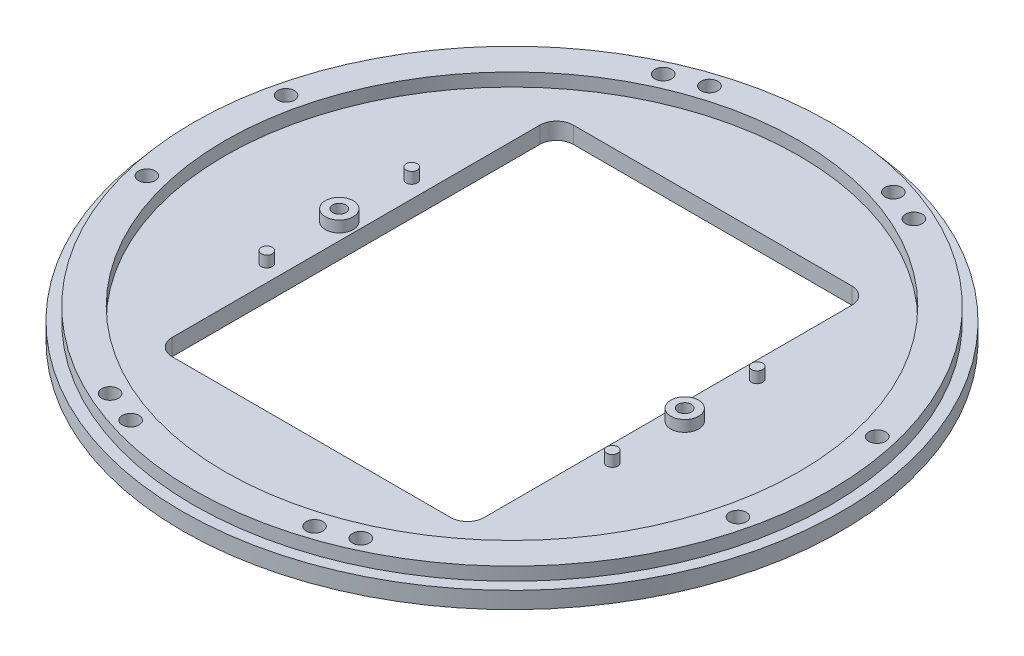
ISO-10303-21;
HEADER;
FILE_DESCRIPTION(('STEP AP214'),'2;1');
FILE_NAME('part.step','',(''),(''),'','','');
FILE_SCHEMA(('AUTOMOTIVE_DESIGN { 1 0 10303 214 1 1 1 1 }'));
ENDSEC;
DATA;
#1=APPLICATION_CONTEXT('core data for automotive mechanical design processes');
#2=APPLICATION_PROTOCOL_DEFINITION('international standard','automotive_design',2000,#1);
#3=PRODUCT_CONTEXT('',#1,'mechanical');
#4=PRODUCT('Part','Part','',(#3));
#5=PRODUCT_RELATED_PRODUCT_CATEGORY('part','',(#4));
#6=PRODUCT_DEFINITION_FORMATION('','',#4);
#7=PRODUCT_DEFINITION_CONTEXT('part definition',#1,'design');
#8=PRODUCT_DEFINITION('design','',#6,#7);
#9=PRODUCT_DEFINITION_SHAPE('','',#8);
#10=(LENGTH_UNIT() NAMED_UNIT(*) SI_UNIT(.MILLI.,.METRE.));
#11=(NAMED_UNIT(*) PLANE_ANGLE_UNIT() SI_UNIT($,.RADIAN.));
#12=(NAMED_UNIT(*) SI_UNIT($,.STERADIAN.) SOLID_ANGLE_UNIT());
#13=UNCERTAINTY_MEASURE_WITH_UNIT(LENGTH_MEASURE(1.E-05),#10,'distance_accuracy_value','');
#14=(GEOMETRIC_REPRESENTATION_CONTEXT(3) GLOBAL_UNCERTAINTY_ASSIGNED_CONTEXT((#13)) GLOBAL_UNIT_ASSIGNED_CONTEXT((#10,
#11,#12)) REPRESENTATION_CONTEXT('',''));
#15=CARTESIAN_POINT('',(0.,0.,0.));
#16=DIRECTION('',(0.,0.,1.));
#17=DIRECTION('',(1.,0.,0.));
#18=AXIS2_PLACEMENT_3D('',#15,#16,#17);
#19=CARTESIAN_POINT('',(0.,0.,0.));
#20=DIRECTION('',(0.,-1.,0.));
#21=DIRECTION('',(0.,0.,-1.));
#22=AXIS2_PLACEMENT_3D('',#19,#20,#21);
#23=CYLINDRICAL_SURFACE('',#22,51.5);
#24=CARTESIAN_POINT('',(0.,2.35000000000001,0.));
#25=DIRECTION('',(0.,-1.,0.));
#26=DIRECTION('',(0.,0.,-1.));
#27=AXIS2_PLACEMENT_3D('',#24,#25,#26);
#28=CIRCLE('',#27,51.5);
#29=CARTESIAN_POINT('',(0.,2.35000000000001,-51.5));
#30=VERTEX_POINT('',#29);
#31=EDGE_CURVE('E220',#30,#30,#28,.T.);
#32=ORIENTED_EDGE('',*,*,#31,.F.);
#33=EDGE_LOOP('',(#32));
#34=FACE_BOUND('',#33,.T.);
#35=CARTESIAN_POINT('',(0.,0.,0.));
#36=DIRECTION('',(0.,-1.,0.));
#37=DIRECTION('',(0.,0.,-1.));
#38=AXIS2_PLACEMENT_3D('',#35,#36,#37);
#39=CIRCLE('',#38,51.5);
#40=CARTESIAN_POINT('',(0.,0.,-51.5));
#41=VERTEX_POINT('',#40);
#42=EDGE_CURVE('E178',#41,#41,#39,.F.);
#43=ORIENTED_EDGE('',*,*,#42,.F.);
#44=EDGE_LOOP('',(#43));
#45=FACE_BOUND('',#44,.T.);
#46=ADVANCED_FACE('F58',(#34,#45),#23,.F.);
#47=CARTESIAN_POINT('',(57.15,2.35000000000001,0.));
#48=DIRECTION('',(0.,1.,0.));
#49=DIRECTION('',(0.,0.,1.));
#50=AXIS2_PLACEMENT_3D('',#47,#48,#49);
#51=PLANE('',#50);
#52=CARTESIAN_POINT('',(-53.0471488394994,2.35000000000001,-12.5));
#53=DIRECTION('',(0.,-1.,0.));
#54=DIRECTION('',(0.,0.,1.));
#55=AXIS2_PLACEMENT_3D('',#52,#53,#54);
#56=CIRCLE('',#55,1.5);
#57=CARTESIAN_POINT('',(-53.0471488394994,2.35000000000001,-11.));
#58=VERTEX_POINT('',#57);
#59=EDGE_CURVE('E569',#58,#58,#56,.T.);
#60=ORIENTED_EDGE('',*,*,#59,.T.);
#61=EDGE_LOOP('',(#60));
#62=FACE_BOUND('',#61,.T.);
#63=CARTESIAN_POINT('',(53.0471488394994,2.35000000000001,-12.5));
#64=DIRECTION('',(0.,-1.,0.));
#65=DIRECTION('',(0.,0.,-1.));
#66=AXIS2_PLACEMENT_3D('',#63,#64,#65);
#67=CIRCLE('',#66,1.5);
#68=CARTESIAN_POINT('',(53.0471488394994,2.35000000000001,-14.));
#69=VERTEX_POINT('',#68);
#70=EDGE_CURVE('E573',#69,#69,#67,.T.);
#71=ORIENTED_EDGE('',*,*,#70,.T.);
#72=EDGE_LOOP('',(#71));
#73=FACE_BOUND('',#72,.T.);
#74=CARTESIAN_POINT('',(53.0471488394994,2.35000000000001,12.5));
#75=DIRECTION('',(0.,-1.,0.));
#76=DIRECTION('',(0.,0.,1.));
#77=AXIS2_PLACEMENT_3D('',#74,#75,#76);
#78=CIRCLE('',#77,1.5);
#79=CARTESIAN_POINT('',(53.0471488394994,2.35000000000001,14.));
#80=VERTEX_POINT('',#79);
#81=EDGE_CURVE('E565',#80,#80,#78,.T.);
#82=ORIENTED_EDGE('',*,*,#81,.T.);
#83=EDGE_LOOP('',(#82));
#84=FACE_BOUND('',#83,.T.);
#85=CARTESIAN_POINT('',(-53.0471488394994,2.35000000000001,12.5));
#86=DIRECTION('',(0.,-1.,0.));
#87=DIRECTION('',(0.,0.,-1.));
#88=AXIS2_PLACEMENT_3D('',#85,#86,#87);
#89=CIRCLE('',#88,1.5);
#90=CARTESIAN_POINT('',(-53.0471488394994,2.35000000000001,11.));
#91=VERTEX_POINT('',#90);
#92=EDGE_CURVE('E521',#91,#91,#89,.T.);
#93=ORIENTED_EDGE('',*,*,#92,.T.);
#94=EDGE_LOOP('',(#93));
#95=FACE_BOUND('',#94,.T.);
#96=CARTESIAN_POINT('',(-22.5,2.35000000000001,49.6386945839634));
#97=DIRECTION('',(0.,1.,0.));
#98=DIRECTION('',(0.,0.,1.));
#99=AXIS2_PLACEMENT_3D('',#96,#97,#98);
#100=CIRCLE('',#99,1.5);
#101=CARTESIAN_POINT('',(-22.5,2.35000000000001,51.1386945839634));
#102=VERTEX_POINT('',#101);
#103=EDGE_CURVE('E183',#102,#102,#100,.T.);
#104=ORIENTED_EDGE('',*,*,#103,.F.);
#105=EDGE_LOOP('',(#104));
#106=FACE_BOUND('',#105,.T.);
#107=CARTESIAN_POINT('',(-22.5,2.35000000000001,-49.6386945839634));
#108=DIRECTION('',(0.,1.,0.));
#109=DIRECTION('',(0.,0.,-1.));
#110=AXIS2_PLACEMENT_3D('',#107,#108,#109);
#111=CIRCLE('',#110,1.50000000000001);
#112=CARTESIAN_POINT('',(-22.5,2.35000000000001,-51.1386945839634));
#113=VERTEX_POINT('',#112);
#114=EDGE_CURVE('E189',#113,#113,#111,.T.);
#115=ORIENTED_EDGE('',*,*,#114,.F.);
#116=EDGE_LOOP('',(#115));
#117=FACE_BOUND('',#116,.T.);
#118=CARTESIAN_POINT('',(-16.5,2.35000000000001,-51.9422756528822));
#119=DIRECTION('',(0.,1.,0.));
#120=DIRECTION('',(0.,0.,-1.));
#121=AXIS2_PLACEMENT_3D('',#118,#119,#120);
#122=CIRCLE('',#121,1.50000000000001);
#123=CARTESIAN_POINT('',(-16.5,2.35000000000001,-53.4422756528822));
#124=VERTEX_POINT('',#123);
#125=EDGE_CURVE('E195',#124,#124,#122,.T.);
#126=ORIENTED_EDGE('',*,*,#125,.F.);
#127=EDGE_LOOP('',(#126));
#128=FACE_BOUND('',#127,.T.);
#129=CARTESIAN_POINT('',(16.5,2.35000000000001,-51.9422756528822));
#130=DIRECTION('',(0.,1.,0.));
#131=DIRECTION('',(0.,0.,1.));
#132=AXIS2_PLACEMENT_3D('',#129,#130,#131);
#133=CIRCLE('',#132,1.50000000000001);
#134=CARTESIAN_POINT('',(16.5,2.35000000000001,-50.4422756528822));
#135=VERTEX_POINT('',#134);
#136=EDGE_CURVE('E162',#135,#135,#133,.T.);
#137=ORIENTED_EDGE('',*,*,#136,.F.);
#138=EDGE_LOOP('',(#137));
#139=FACE_BOUND('',#138,.T.);
#140=CARTESIAN_POINT('',(22.5,2.35000000000001,-49.6386945839634));
#141=DIRECTION('',(0.,1.,0.));
#142=DIRECTION('',(0.,0.,1.));
#143=AXIS2_PLACEMENT_3D('',#140,#141,#142);
#144=CIRCLE('',#143,1.50000000000001);
#145=CARTESIAN_POINT('',(22.5,2.35000000000001,-48.1386945839634));
#146=VERTEX_POINT('',#145);
#147=EDGE_CURVE('E163',#146,#146,#144,.T.);
#148=ORIENTED_EDGE('',*,*,#147,.F.);
#149=EDGE_LOOP('',(#148));
#150=FACE_BOUND('',#149,.T.);
#151=CARTESIAN_POINT('',(22.5,2.35000000000001,49.6386945839634));
#152=DIRECTION('',(0.,1.,0.));
#153=DIRECTION('',(0.,0.,-1.));
#154=AXIS2_PLACEMENT_3D('',#151,#152,#153);
#155=CIRCLE('',#154,1.5);
#156=CARTESIAN_POINT('',(22.5,2.35000000000001,48.1386945839634));
#157=VERTEX_POINT('',#156);
#158=EDGE_CURVE('E169',#157,#157,#155,.T.);
#159=ORIENTED_EDGE('',*,*,#158,.F.);
#160=EDGE_LOOP('',(#159));
#161=FACE_BOUND('',#160,.T.);
#162=CARTESIAN_POINT('',(16.5,2.35000000000001,51.9422756528822));
#163=DIRECTION('',(0.,1.,0.));
#164=DIRECTION('',(0.,0.,-1.));
#165=AXIS2_PLACEMENT_3D('',#162,#163,#164);
#166=CIRCLE('',#165,1.5);
#167=CARTESIAN_POINT('',(16.5,2.35000000000001,50.4422756528822));
#168=VERTEX_POINT('',#167);
#169=EDGE_CURVE('E175',#168,#168,#166,.T.);
#170=ORIENTED_EDGE('',*,*,#169,.F.);
#171=EDGE_LOOP('',(#170));
#172=FACE_BOUND('',#171,.T.);
#173=CARTESIAN_POINT('',(-16.5,2.35000000000001,51.9422756528822));
#174=DIRECTION('',(0.,1.,0.));
#175=DIRECTION('',(0.,0.,1.));
#176=AXIS2_PLACEMENT_3D('',#173,#174,#175);
#177=CIRCLE('',#176,1.5);
#178=CARTESIAN_POINT('',(-16.5,2.35000000000001,53.4422756528822));
#179=VERTEX_POINT('',#178);
#180=EDGE_CURVE('E182',#179,#179,#177,.T.);
#181=ORIENTED_EDGE('',*,*,#180,.F.);
#182=EDGE_LOOP('',(#181));
#183=FACE_BOUND('',#182,.T.);
#184=ORIENTED_EDGE('',*,*,#31,.T.);
#185=EDGE_LOOP('',(#184));
#186=FACE_BOUND('',#185,.T.);
#187=CARTESIAN_POINT('',(0.,2.35000000000001,0.));
#188=DIRECTION('',(0.,-1.,0.));
#189=DIRECTION('',(0.,0.,-1.));
#190=AXIS2_PLACEMENT_3D('',#187,#188,#189);
#191=CIRCLE('',#190,57.15);
#192=CARTESIAN_POINT('',(0.,2.35000000000001,-57.15));
#193=VERTEX_POINT('',#192);
#194=EDGE_CURVE('E206',#193,#193,#191,.T.);
#195=ORIENTED_EDGE('',*,*,#194,.F.);
#196=EDGE_LOOP('',(#195));
#197=FACE_BOUND('',#196,.T.);
#198=ADVANCED_FACE('F291',(#62,#73,#84,#95,#106,#117,#128,#139,#150,#161,#172,#183,#186,#197),
#51,.T.);
#199=CARTESIAN_POINT('',(51.5,-2.99999999999999,0.));
#200=DIRECTION('',(0.,-1.,0.));
#201=DIRECTION('',(0.,0.,-1.));
#202=AXIS2_PLACEMENT_3D('',#199,#200,#201);
#203=PLANE('',#202);
#204=CARTESIAN_POINT('',(-53.0471488394994,-2.99999999999999,-12.5));
#205=DIRECTION('',(0.,-1.,0.));
#206=DIRECTION('',(0.,0.,1.));
#207=AXIS2_PLACEMENT_3D('',#204,#205,#206);
#208=CIRCLE('',#207,1.5);
#209=CARTESIAN_POINT('',(-53.0471488394994,-2.99999999999999,-11.));
#210=VERTEX_POINT('',#209);
#211=EDGE_CURVE('E450',#210,#210,#208,.T.);
#212=ORIENTED_EDGE('',*,*,#211,.F.);
#213=EDGE_LOOP('',(#212));
#214=FACE_BOUND('',#213,.T.);
#215=CARTESIAN_POINT('',(53.0471488394994,-2.99999999999999,-12.5));
#216=DIRECTION('',(0.,-1.,0.));
#217=DIRECTION('',(0.,0.,-1.));
#218=AXIS2_PLACEMENT_3D('',#215,#216,#217);
#219=CIRCLE('',#218,1.5);
#220=CARTESIAN_POINT('',(53.0471488394994,-2.99999999999999,-14.));
#221=VERTEX_POINT('',#220);
#222=EDGE_CURVE('E454',#221,#221,#219,.T.);
#223=ORIENTED_EDGE('',*,*,#222,.F.);
#224=EDGE_LOOP('',(#223));
#225=FACE_BOUND('',#224,.T.);
#226=CARTESIAN_POINT('',(53.0471488394994,-2.99999999999999,12.5));
#227=DIRECTION('',(0.,-1.,0.));
#228=DIRECTION('',(0.,0.,1.));
#229=AXIS2_PLACEMENT_3D('',#226,#227,#228);
#230=CIRCLE('',#229,1.5);
#231=CARTESIAN_POINT('',(53.0471488394994,-2.99999999999999,14.));
#232=VERTEX_POINT('',#231);
#233=EDGE_CURVE('E458',#232,#232,#230,.T.);
#234=ORIENTED_EDGE('',*,*,#233,.F.);
#235=EDGE_LOOP('',(#234));
#236=FACE_BOUND('',#235,.T.);
#237=CARTESIAN_POINT('',(-53.0471488394994,-2.99999999999999,12.5));
#238=DIRECTION('',(0.,-1.,0.));
#239=DIRECTION('',(0.,0.,-1.));
#240=AXIS2_PLACEMENT_3D('',#237,#238,#239);
#241=CIRCLE('',#240,1.5);
#242=CARTESIAN_POINT('',(-53.0471488394994,-2.99999999999999,11.));
#243=VERTEX_POINT('',#242);
#244=EDGE_CURVE('E462',#243,#243,#241,.T.);
#245=ORIENTED_EDGE('',*,*,#244,.F.);
#246=EDGE_LOOP('',(#245));
#247=FACE_BOUND('',#246,.T.);
#248=CARTESIAN_POINT('',(31.,-2.99999999999999,0.));
#249=DIRECTION('',(0.,1.,0.));
#250=DIRECTION('',(0.,0.,1.));
#251=AXIS2_PLACEMENT_3D('',#248,#249,#250);
#252=CIRCLE('',#251,1.2);
#253=CARTESIAN_POINT('',(31.,-2.99999999999999,1.2));
#254=VERTEX_POINT('',#253);
#255=EDGE_CURVE('E466',#254,#254,#252,.T.);
#256=ORIENTED_EDGE('',*,*,#255,.T.);
#257=EDGE_LOOP('',(#256));
#258=FACE_BOUND('',#257,.T.);
#259=CARTESIAN_POINT('',(-31.,-2.99999999999999,0.));
#260=DIRECTION('',(0.,1.,0.));
#261=DIRECTION('',(0.,0.,1.));
#262=AXIS2_PLACEMENT_3D('',#259,#260,#261);
#263=CIRCLE('',#262,1.2);
#264=CARTESIAN_POINT('',(-31.,-2.99999999999999,1.20000000000001));
#265=VERTEX_POINT('',#264);
#266=EDGE_CURVE('E470',#265,#265,#263,.T.);
#267=ORIENTED_EDGE('',*,*,#266,.T.);
#268=EDGE_LOOP('',(#267));
#269=FACE_BOUND('',#268,.T.);
#270=CARTESIAN_POINT('',(-22.5,-2.99999999999999,49.6386945839634));
#271=DIRECTION('',(0.,1.,0.));
#272=DIRECTION('',(0.,0.,1.));
#273=AXIS2_PLACEMENT_3D('',#270,#271,#272);
#274=CIRCLE('',#273,1.5);
#275=CARTESIAN_POINT('',(-22.5,-2.99999999999999,51.1386945839634));
#276=VERTEX_POINT('',#275);
#277=EDGE_CURVE('E179',#276,#276,#274,.T.);
#278=ORIENTED_EDGE('',*,*,#277,.T.);
#279=EDGE_LOOP('',(#278));
#280=FACE_BOUND('',#279,.T.);
#281=CARTESIAN_POINT('',(-22.5,-2.99999999999999,-49.6386945839634));
#282=DIRECTION('',(0.,1.,0.));
#283=DIRECTION('',(0.,0.,-1.));
#284=AXIS2_PLACEMENT_3D('',#281,#282,#283);
#285=CIRCLE('',#284,1.50000000000001);
#286=CARTESIAN_POINT('',(-22.5,-2.99999999999999,-51.1386945839634));
#287=VERTEX_POINT('',#286);
#288=EDGE_CURVE('E186',#287,#287,#285,.T.);
#289=ORIENTED_EDGE('',*,*,#288,.T.);
#290=EDGE_LOOP('',(#289));
#291=FACE_BOUND('',#290,.T.);
#292=CARTESIAN_POINT('',(-16.5,-2.99999999999999,-51.9422756528822));
#293=DIRECTION('',(0.,1.,0.));
#294=DIRECTION('',(0.,0.,-1.));
#295=AXIS2_PLACEMENT_3D('',#292,#293,#294);
#296=CIRCLE('',#295,1.50000000000001);
#297=CARTESIAN_POINT('',(-16.5,-2.99999999999999,-53.4422756528822));
#298=VERTEX_POINT('',#297);
#299=EDGE_CURVE('E192',#298,#298,#296,.T.);
#300=ORIENTED_EDGE('',*,*,#299,.T.);
#301=EDGE_LOOP('',(#300));
#302=FACE_BOUND('',#301,.T.);
#303=CARTESIAN_POINT('',(16.5,-2.99999999999999,-51.9422756528822));
#304=DIRECTION('',(0.,1.,0.));
#305=DIRECTION('',(0.,0.,1.));
#306=AXIS2_PLACEMENT_3D('',#303,#304,#305);
#307=CIRCLE('',#306,1.50000000000001);
#308=CARTESIAN_POINT('',(16.5,-2.99999999999999,-50.4422756528822));
#309=VERTEX_POINT('',#308);
#310=EDGE_CURVE('E198',#309,#309,#307,.T.);
#311=ORIENTED_EDGE('',*,*,#310,.T.);
#312=EDGE_LOOP('',(#311));
#313=FACE_BOUND('',#312,.T.);
#314=CARTESIAN_POINT('',(22.5,-2.99999999999999,-49.6386945839634));
#315=DIRECTION('',(0.,1.,0.));
#316=DIRECTION('',(0.,0.,1.));
#317=AXIS2_PLACEMENT_3D('',#314,#315,#316);
#318=CIRCLE('',#317,1.50000000000001);
#319=CARTESIAN_POINT('',(22.5,-2.99999999999999,-48.1386945839634));
#320=VERTEX_POINT('',#319);
#321=EDGE_CURVE('E159',#320,#320,#318,.T.);
#322=ORIENTED_EDGE('',*,*,#321,.T.);
#323=EDGE_LOOP('',(#322));
#324=FACE_BOUND('',#323,.T.);
#325=CARTESIAN_POINT('',(22.5,-2.99999999999999,49.6386945839634));
#326=DIRECTION('',(0.,1.,0.));
#327=DIRECTION('',(0.,0.,-1.));
#328=AXIS2_PLACEMENT_3D('',#325,#326,#327);
#329=CIRCLE('',#328,1.5);
#330=CARTESIAN_POINT('',(22.5,-2.99999999999999,48.1386945839634));
#331=VERTEX_POINT('',#330);
#332=EDGE_CURVE('E166',#331,#331,#329,.T.);
#333=ORIENTED_EDGE('',*,*,#332,.T.);
#334=EDGE_LOOP('',(#333));
#335=FACE_BOUND('',#334,.T.);
#336=CARTESIAN_POINT('',(16.5,-2.99999999999999,51.9422756528822));
#337=DIRECTION('',(0.,1.,0.));
#338=DIRECTION('',(0.,0.,-1.));
#339=AXIS2_PLACEMENT_3D('',#336,#337,#338);
#340=CIRCLE('',#339,1.5);
#341=CARTESIAN_POINT('',(16.5,-2.99999999999999,50.4422756528822));
#342=VERTEX_POINT('',#341);
#343=EDGE_CURVE('E172',#342,#342,#340,.T.);
#344=ORIENTED_EDGE('',*,*,#343,.T.);
#345=EDGE_LOOP('',(#344));
#346=FACE_BOUND('',#345,.T.);
#347=CARTESIAN_POINT('',(-16.5,-2.99999999999999,51.9422756528822));
#348=DIRECTION('',(0.,1.,0.));
#349=DIRECTION('',(0.,0.,1.));
#350=AXIS2_PLACEMENT_3D('',#347,#348,#349);
#351=CIRCLE('',#350,1.5);
#352=CARTESIAN_POINT('',(-16.5,-2.99999999999999,53.4422756528822));
#353=VERTEX_POINT('',#352);
#354=EDGE_CURVE('E203',#353,#353,#351,.T.);
#355=ORIENTED_EDGE('',*,*,#354,.T.);
#356=EDGE_LOOP('',(#355));
#357=FACE_BOUND('',#356,.T.);
#358=CARTESIAN_POINT('',(0.,-2.99999999999999,0.));
#359=DIRECTION('',(0.,-1.,0.));
#360=DIRECTION('',(0.,0.,-1.));
#361=AXIS2_PLACEMENT_3D('',#358,#359,#360);
#362=CIRCLE('',#361,59.15);
#363=CARTESIAN_POINT('',(0.,-2.99999999999999,-59.15));
#364=VERTEX_POINT('',#363);
#365=EDGE_CURVE('E217',#364,#364,#362,.T.);
#366=ORIENTED_EDGE('',*,*,#365,.T.);
#367=EDGE_LOOP('',(#366));
#368=FACE_BOUND('',#367,.T.);
#369=DIRECTION('',(1.,0.,0.));
#370=VECTOR('',#369,1.);
#371=CARTESIAN_POINT('',(0.,-2.99999999999999,-36.));
#372=LINE('',#371,#370);
#373=CARTESIAN_POINT('',(-25.,-2.99999999999999,-36.));
#374=VERTEX_POINT('',#373);
#375=CARTESIAN_POINT('',(25.,-2.99999999999999,-36.));
#376=VERTEX_POINT('',#375);
#377=EDGE_CURVE('E148',#374,#376,#372,.T.);
#378=ORIENTED_EDGE('',*,*,#377,.F.);
#379=CARTESIAN_POINT('',(-25.,-2.99999999999999,-33.));
#380=DIRECTION('',(0.,-1.,0.));
#381=DIRECTION('',(0.,0.,-1.));
#382=AXIS2_PLACEMENT_3D('',#379,#380,#381);
#383=CIRCLE('',#382,3.);
#384=CARTESIAN_POINT('',(-28.,-2.99999999999999,-33.));
#385=VERTEX_POINT('',#384);
#386=EDGE_CURVE('E66',#374,#385,#383,.F.);
#387=ORIENTED_EDGE('',*,*,#386,.T.);
#388=DIRECTION('',(0.,0.,-1.));
#389=VECTOR('',#388,1.);
#390=CARTESIAN_POINT('',(-28.,-2.99999999999999,0.));
#391=LINE('',#390,#389);
#392=CARTESIAN_POINT('',(-28.,-2.99999999999999,33.));
#393=VERTEX_POINT('',#392);
#394=EDGE_CURVE('E139',#393,#385,#391,.T.);
#395=ORIENTED_EDGE('',*,*,#394,.F.);
#396=CARTESIAN_POINT('',(-25.,-2.99999999999999,33.));
#397=DIRECTION('',(0.,-1.,0.));
#398=DIRECTION('',(0.,0.,-1.));
#399=AXIS2_PLACEMENT_3D('',#396,#397,#398);
#400=CIRCLE('',#399,3.);
#401=CARTESIAN_POINT('',(-25.,-2.99999999999999,36.));
#402=VERTEX_POINT('',#401);
#403=EDGE_CURVE('E123',#393,#402,#400,.F.);
#404=ORIENTED_EDGE('',*,*,#403,.T.);
#405=DIRECTION('',(1.,0.,0.));
#406=VECTOR('',#405,1.);
#407=CARTESIAN_POINT('',(0.,-2.99999999999999,36.));
#408=LINE('',#407,#406);
#409=CARTESIAN_POINT('',(25.,-2.99999999999999,36.));
#410=VERTEX_POINT('',#409);
#411=EDGE_CURVE('E147',#402,#410,#408,.T.);
#412=ORIENTED_EDGE('',*,*,#411,.T.);
#413=CARTESIAN_POINT('',(25.,-2.99999999999999,33.));
#414=DIRECTION('',(0.,-1.,0.));
#415=DIRECTION('',(0.,0.,-1.));
#416=AXIS2_PLACEMENT_3D('',#413,#414,#415);
#417=CIRCLE('',#416,3.);
#418=CARTESIAN_POINT('',(28.,-2.99999999999999,33.));
#419=VERTEX_POINT('',#418);
#420=EDGE_CURVE('E255',#410,#419,#417,.F.);
#421=ORIENTED_EDGE('',*,*,#420,.T.);
#422=DIRECTION('',(0.,0.,-1.));
#423=VECTOR('',#422,1.);
#424=CARTESIAN_POINT('',(28.,-2.99999999999999,0.));
#425=LINE('',#424,#423);
#426=CARTESIAN_POINT('',(28.,-2.99999999999999,-33.));
#427=VERTEX_POINT('',#426);
#428=EDGE_CURVE('E150',#419,#427,#425,.T.);
#429=ORIENTED_EDGE('',*,*,#428,.T.);
#430=CARTESIAN_POINT('',(25.,-2.99999999999999,-33.));
#431=DIRECTION('',(0.,-1.,0.));
#432=DIRECTION('',(0.,0.,-1.));
#433=AXIS2_PLACEMENT_3D('',#430,#431,#432);
#434=CIRCLE('',#433,3.);
#435=EDGE_CURVE('E259',#427,#376,#434,.F.);
#436=ORIENTED_EDGE('',*,*,#435,.T.);
#437=EDGE_LOOP('',(#378,#387,#395,#404,#412,#421,#429,#436));
#438=FACE_BOUND('',#437,.T.);
#439=ADVANCED_FACE('F146',(#214,#225,#236,#247,#258,#269,#280,#291,#302,#313,#324,#335,#346,
#357,#368,#438),#203,.T.);
#440=CARTESIAN_POINT('',(0.,0.,0.));
#441=DIRECTION('',(0.,-1.,0.));
#442=DIRECTION('',(0.,0.,-1.));
#443=AXIS2_PLACEMENT_3D('',#440,#441,#442);
#444=CYLINDRICAL_SURFACE('',#443,59.15);
#445=CARTESIAN_POINT('',(0.,0.,0.));
#446=DIRECTION('',(0.,-1.,0.));
#447=DIRECTION('',(0.,0.,-1.));
#448=AXIS2_PLACEMENT_3D('',#445,#446,#447);
#449=CIRCLE('',#448,59.15);
#450=CARTESIAN_POINT('',(0.,0.,-59.15));
#451=VERTEX_POINT('',#450);
#452=EDGE_CURVE('E214',#451,#451,#449,.T.);
#453=ORIENTED_EDGE('',*,*,#452,.T.);
#454=EDGE_LOOP('',(#453));
#455=FACE_BOUND('',#454,.T.);
#456=ORIENTED_EDGE('',*,*,#365,.F.);
#457=EDGE_LOOP('',(#456));
#458=FACE_BOUND('',#457,.T.);
#459=ADVANCED_FACE('F434',(#455,#458),#444,.T.);
#460=CARTESIAN_POINT('',(59.15,0.,0.));
#461=DIRECTION('',(0.,1.,0.));
#462=DIRECTION('',(0.,0.,1.));
#463=AXIS2_PLACEMENT_3D('',#460,#461,#462);
#464=PLANE('',#463);
#465=CARTESIAN_POINT('',(0.,0.,0.));
#466=DIRECTION('',(0.,-1.,0.));
#467=DIRECTION('',(0.,0.,-1.));
#468=AXIS2_PLACEMENT_3D('',#465,#466,#467);
#469=CIRCLE('',#468,57.15);
#470=CARTESIAN_POINT('',(0.,0.,-57.15));
#471=VERTEX_POINT('',#470);
#472=EDGE_CURVE('E211',#471,#471,#469,.T.);
#473=ORIENTED_EDGE('',*,*,#472,.T.);
#474=EDGE_LOOP('',(#473));
#475=FACE_BOUND('',#474,.T.);
#476=ORIENTED_EDGE('',*,*,#452,.F.);
#477=EDGE_LOOP('',(#476));
#478=FACE_BOUND('',#477,.T.);
#479=ADVANCED_FACE('F431',(#475,#478),#464,.T.);
#480=CARTESIAN_POINT('',(0.,0.,0.));
#481=DIRECTION('',(0.,-1.,0.));
#482=DIRECTION('',(0.,0.,-1.));
#483=AXIS2_PLACEMENT_3D('',#480,#481,#482);
#484=CYLINDRICAL_SURFACE('',#483,57.15);
#485=ORIENTED_EDGE('',*,*,#194,.T.);
#486=EDGE_LOOP('',(#485));
#487=FACE_BOUND('',#486,.T.);
#488=ORIENTED_EDGE('',*,*,#472,.F.);
#489=EDGE_LOOP('',(#488));
#490=FACE_BOUND('',#489,.T.);
#491=ADVANCED_FACE('F427',(#487,#490),#484,.T.);
#492=CARTESIAN_POINT('',(-16.5,-2.99999999999999,51.9422756528822));
#493=DIRECTION('',(0.,1.,0.));
#494=DIRECTION('',(0.,0.,1.));
#495=AXIS2_PLACEMENT_3D('',#492,#493,#494);
#496=CYLINDRICAL_SURFACE('',#495,1.5);
#497=ORIENTED_EDGE('',*,*,#354,.F.);
#498=EDGE_LOOP('',(#497));
#499=FACE_BOUND('',#498,.T.);
#500=ORIENTED_EDGE('',*,*,#180,.T.);
#501=EDGE_LOOP('',(#500));
#502=FACE_BOUND('',#501,.T.);
#503=ADVANCED_FACE('F409',(#499,#502),#496,.F.);
#504=CARTESIAN_POINT('',(16.5,-2.99999999999999,51.9422756528822));
#505=DIRECTION('',(0.,1.,0.));
#506=DIRECTION('',(0.,0.,1.));
#507=AXIS2_PLACEMENT_3D('',#504,#505,#506);
#508=CYLINDRICAL_SURFACE('',#507,1.5);
#509=ORIENTED_EDGE('',*,*,#343,.F.);
#510=EDGE_LOOP('',(#509));
#511=FACE_BOUND('',#510,.T.);
#512=ORIENTED_EDGE('',*,*,#169,.T.);
#513=EDGE_LOOP('',(#512));
#514=FACE_BOUND('',#513,.T.);
#515=ADVANCED_FACE('F405',(#511,#514),#508,.F.);
#516=CARTESIAN_POINT('',(22.5,-2.99999999999999,49.6386945839634));
#517=DIRECTION('',(0.,1.,0.));
#518=DIRECTION('',(0.,0.,1.));
#519=AXIS2_PLACEMENT_3D('',#516,#517,#518);
#520=CYLINDRICAL_SURFACE('',#519,1.5);
#521=ORIENTED_EDGE('',*,*,#332,.F.);
#522=EDGE_LOOP('',(#521));
#523=FACE_BOUND('',#522,.T.);
#524=ORIENTED_EDGE('',*,*,#158,.T.);
#525=EDGE_LOOP('',(#524));
#526=FACE_BOUND('',#525,.T.);
#527=ADVANCED_FACE('F401',(#523,#526),#520,.F.);
#528=CARTESIAN_POINT('',(22.5,-2.99999999999999,-49.6386945839634));
#529=DIRECTION('',(0.,1.,0.));
#530=DIRECTION('',(0.,0.,1.));
#531=AXIS2_PLACEMENT_3D('',#528,#529,#530);
#532=CYLINDRICAL_SURFACE('',#531,1.50000000000001);
#533=ORIENTED_EDGE('',*,*,#321,.F.);
#534=EDGE_LOOP('',(#533));
#535=FACE_BOUND('',#534,.T.);
#536=ORIENTED_EDGE('',*,*,#147,.T.);
#537=EDGE_LOOP('',(#536));
#538=FACE_BOUND('',#537,.T.);
#539=ADVANCED_FACE('F397',(#535,#538),#532,.F.);
#540=CARTESIAN_POINT('',(16.5,-2.99999999999999,-51.9422756528822));
#541=DIRECTION('',(0.,1.,0.));
#542=DIRECTION('',(0.,0.,1.));
#543=AXIS2_PLACEMENT_3D('',#540,#541,#542);
#544=CYLINDRICAL_SURFACE('',#543,1.50000000000001);
#545=ORIENTED_EDGE('',*,*,#310,.F.);
#546=EDGE_LOOP('',(#545));
#547=FACE_BOUND('',#546,.T.);
#548=ORIENTED_EDGE('',*,*,#136,.T.);
#549=EDGE_LOOP('',(#548));
#550=FACE_BOUND('',#549,.T.);
#551=ADVANCED_FACE('F400',(#547,#550),#544,.F.);
#552=CARTESIAN_POINT('',(-16.5,-2.99999999999999,-51.9422756528822));
#553=DIRECTION('',(0.,1.,0.));
#554=DIRECTION('',(0.,0.,1.));
#555=AXIS2_PLACEMENT_3D('',#552,#553,#554);
#556=CYLINDRICAL_SURFACE('',#555,1.50000000000001);
#557=ORIENTED_EDGE('',*,*,#299,.F.);
#558=EDGE_LOOP('',(#557));
#559=FACE_BOUND('',#558,.T.);
#560=ORIENTED_EDGE('',*,*,#125,.T.);
#561=EDGE_LOOP('',(#560));
#562=FACE_BOUND('',#561,.T.);
#563=ADVANCED_FACE('F417',(#559,#562),#556,.F.);
#564=CARTESIAN_POINT('',(-22.5,-2.99999999999999,-49.6386945839634));
#565=DIRECTION('',(0.,1.,0.));
#566=DIRECTION('',(0.,0.,1.));
#567=AXIS2_PLACEMENT_3D('',#564,#565,#566);
#568=CYLINDRICAL_SURFACE('',#567,1.50000000000001);
#569=ORIENTED_EDGE('',*,*,#288,.F.);
#570=EDGE_LOOP('',(#569));
#571=FACE_BOUND('',#570,.T.);
#572=ORIENTED_EDGE('',*,*,#114,.T.);
#573=EDGE_LOOP('',(#572));
#574=FACE_BOUND('',#573,.T.);
#575=ADVANCED_FACE('F413',(#571,#574),#568,.F.);
#576=CARTESIAN_POINT('',(-22.5,-2.99999999999999,49.6386945839634));
#577=DIRECTION('',(0.,1.,0.));
#578=DIRECTION('',(0.,0.,1.));
#579=AXIS2_PLACEMENT_3D('',#576,#577,#578);
#580=CYLINDRICAL_SURFACE('',#579,1.5);
#581=ORIENTED_EDGE('',*,*,#277,.F.);
#582=EDGE_LOOP('',(#581));
#583=FACE_BOUND('',#582,.T.);
#584=ORIENTED_EDGE('',*,*,#103,.T.);
#585=EDGE_LOOP('',(#584));
#586=FACE_BOUND('',#585,.T.);
#587=ADVANCED_FACE('F396',(#583,#586),#580,.F.);
#588=CARTESIAN_POINT('',(0.,0.,-36.));
#589=DIRECTION('',(0.,0.,-1.));
#590=DIRECTION('',(-1.,0.,0.));
#591=AXIS2_PLACEMENT_3D('',#588,#589,#590);
#592=PLANE('',#591);
#593=ORIENTED_EDGE('',*,*,#377,.T.);
#594=DIRECTION('',(0.,-1.,0.));
#595=VECTOR('',#594,1.);
#596=CARTESIAN_POINT('',(25.,0.,-36.));
#597=LINE('',#596,#595);
#598=CARTESIAN_POINT('',(25.,0.,-36.));
#599=VERTEX_POINT('',#598);
#600=EDGE_CURVE('E73',#376,#599,#597,.F.);
#601=ORIENTED_EDGE('',*,*,#600,.T.);
#602=DIRECTION('',(1.,0.,0.));
#603=VECTOR('',#602,1.);
#604=CARTESIAN_POINT('',(0.,0.,-36.));
#605=LINE('',#604,#603);
#606=CARTESIAN_POINT('',(-25.,0.,-36.));
#607=VERTEX_POINT('',#606);
#608=EDGE_CURVE('E158',#607,#599,#605,.T.);
#609=ORIENTED_EDGE('',*,*,#608,.F.);
#610=DIRECTION('',(0.,-1.,0.));
#611=VECTOR('',#610,1.);
#612=CARTESIAN_POINT('',(-25.,-2.99999999999999,-36.));
#613=LINE('',#612,#611);
#614=EDGE_CURVE('E250',#607,#374,#613,.T.);
#615=ORIENTED_EDGE('',*,*,#614,.T.);
#616=EDGE_LOOP('',(#593,#601,#609,#615));
#617=FACE_BOUND('',#616,.T.);
#618=ADVANCED_FACE('F278',(#617),#592,.F.);
#619=CARTESIAN_POINT('',(28.,0.,0.));
#620=DIRECTION('',(-1.,0.,0.));
#621=DIRECTION('',(0.,0.,1.));
#622=AXIS2_PLACEMENT_3D('',#619,#620,#621);
#623=PLANE('',#622);
#624=ORIENTED_EDGE('',*,*,#428,.F.);
#625=DIRECTION('',(0.,-1.,0.));
#626=VECTOR('',#625,1.);
#627=CARTESIAN_POINT('',(28.,0.,33.));
#628=LINE('',#627,#626);
#629=CARTESIAN_POINT('',(28.,0.,33.));
#630=VERTEX_POINT('',#629);
#631=EDGE_CURVE('E248',#419,#630,#628,.F.);
#632=ORIENTED_EDGE('',*,*,#631,.T.);
#633=DIRECTION('',(0.,0.,-1.));
#634=VECTOR('',#633,1.);
#635=CARTESIAN_POINT('',(28.,0.,0.));
#636=LINE('',#635,#634);
#637=CARTESIAN_POINT('',(28.,0.,-33.));
#638=VERTEX_POINT('',#637);
#639=EDGE_CURVE('E267',#630,#638,#636,.T.);
#640=ORIENTED_EDGE('',*,*,#639,.T.);
#641=DIRECTION('',(0.,-1.,0.));
#642=VECTOR('',#641,1.);
#643=CARTESIAN_POINT('',(28.,0.,-33.));
#644=LINE('',#643,#642);
#645=EDGE_CURVE('E245',#638,#427,#644,.T.);
#646=ORIENTED_EDGE('',*,*,#645,.T.);
#647=EDGE_LOOP('',(#624,#632,#640,#646));
#648=FACE_BOUND('',#647,.T.);
#649=ADVANCED_FACE('F273',(#648),#623,.T.);
#650=CARTESIAN_POINT('',(0.,0.,36.));
#651=DIRECTION('',(0.,0.,-1.));
#652=DIRECTION('',(-1.,0.,0.));
#653=AXIS2_PLACEMENT_3D('',#650,#651,#652);
#654=PLANE('',#653);
#655=ORIENTED_EDGE('',*,*,#411,.F.);
#656=DIRECTION('',(0.,-1.,0.));
#657=VECTOR('',#656,1.);
#658=CARTESIAN_POINT('',(-25.,0.,36.));
#659=LINE('',#658,#657);
#660=CARTESIAN_POINT('',(-25.,0.,36.));
#661=VERTEX_POINT('',#660);
#662=EDGE_CURVE('E128',#402,#661,#659,.F.);
#663=ORIENTED_EDGE('',*,*,#662,.T.);
#664=DIRECTION('',(1.,0.,0.));
#665=VECTOR('',#664,1.);
#666=CARTESIAN_POINT('',(0.,0.,36.));
#667=LINE('',#666,#665);
#668=CARTESIAN_POINT('',(25.,0.,36.));
#669=VERTEX_POINT('',#668);
#670=EDGE_CURVE('E275',#661,#669,#667,.T.);
#671=ORIENTED_EDGE('',*,*,#670,.T.);
#672=DIRECTION('',(0.,-1.,0.));
#673=VECTOR('',#672,1.);
#674=CARTESIAN_POINT('',(25.,-2.99999999999999,36.));
#675=LINE('',#674,#673);
#676=EDGE_CURVE('E142',#669,#410,#675,.T.);
#677=ORIENTED_EDGE('',*,*,#676,.T.);
#678=EDGE_LOOP('',(#655,#663,#671,#677));
#679=FACE_BOUND('',#678,.T.);
#680=ADVANCED_FACE('F388',(#679),#654,.T.);
#681=CARTESIAN_POINT('',(-28.,0.,0.));
#682=DIRECTION('',(-1.,0.,0.));
#683=DIRECTION('',(0.,0.,1.));
#684=AXIS2_PLACEMENT_3D('',#681,#682,#683);
#685=PLANE('',#684);
#686=DIRECTION('',(0.,0.,-1.));
#687=VECTOR('',#686,1.);
#688=CARTESIAN_POINT('',(-28.,0.,0.));
#689=LINE('',#688,#687);
#690=CARTESIAN_POINT('',(-28.,0.,33.));
#691=VERTEX_POINT('',#690);
#692=CARTESIAN_POINT('',(-28.,0.,-33.));
#693=VERTEX_POINT('',#692);
#694=EDGE_CURVE('E141',#691,#693,#689,.T.);
#695=ORIENTED_EDGE('',*,*,#694,.F.);
#696=DIRECTION('',(0.,-1.,0.));
#697=VECTOR('',#696,1.);
#698=CARTESIAN_POINT('',(-28.,0.,33.));
#699=LINE('',#698,#697);
#700=EDGE_CURVE('E127',#691,#393,#699,.T.);
#701=ORIENTED_EDGE('',*,*,#700,.T.);
#702=ORIENTED_EDGE('',*,*,#394,.T.);
#703=DIRECTION('',(0.,-1.,0.));
#704=VECTOR('',#703,1.);
#705=CARTESIAN_POINT('',(-28.,0.,-33.));
#706=LINE('',#705,#704);
#707=EDGE_CURVE('E143',#385,#693,#706,.F.);
#708=ORIENTED_EDGE('',*,*,#707,.T.);
#709=EDGE_LOOP('',(#695,#701,#702,#708));
#710=FACE_BOUND('',#709,.T.);
#711=ADVANCED_FACE('F138',(#710),#685,.F.);
#712=CARTESIAN_POINT('',(0.,0.,0.));
#713=DIRECTION('',(0.,-1.,0.));
#714=DIRECTION('',(0.,0.,-1.));
#715=AXIS2_PLACEMENT_3D('',#712,#713,#714);
#716=PLANE('',#715);
#717=CARTESIAN_POINT('',(-31.,0.,0.));
#718=DIRECTION('',(0.,-1.,0.));
#719=DIRECTION('',(0.,0.,-1.));
#720=AXIS2_PLACEMENT_3D('',#717,#718,#719);
#721=CIRCLE('',#720,2.5);
#722=CARTESIAN_POINT('',(-31.,0.,-2.49999999999999));
#723=VERTEX_POINT('',#722);
#724=EDGE_CURVE('E238',#723,#723,#721,.F.);
#725=ORIENTED_EDGE('',*,*,#724,.F.);
#726=EDGE_LOOP('',(#725));
#727=FACE_BOUND('',#726,.T.);
#728=CARTESIAN_POINT('',(31.,0.,0.));
#729=DIRECTION('',(0.,-1.,0.));
#730=DIRECTION('',(0.,0.,-1.));
#731=AXIS2_PLACEMENT_3D('',#728,#729,#730);
#732=CIRCLE('',#731,2.5);
#733=CARTESIAN_POINT('',(31.,0.,-2.5));
#734=VERTEX_POINT('',#733);
#735=EDGE_CURVE('E235',#734,#734,#732,.F.);
#736=ORIENTED_EDGE('',*,*,#735,.F.);
#737=EDGE_LOOP('',(#736));
#738=FACE_BOUND('',#737,.T.);
#739=CARTESIAN_POINT('',(31.,0.,-13.));
#740=DIRECTION('',(0.,-1.,0.));
#741=DIRECTION('',(0.,0.,-1.));
#742=AXIS2_PLACEMENT_3D('',#739,#740,#741);
#743=CIRCLE('',#742,0.999999999999998);
#744=CARTESIAN_POINT('',(31.,0.,-14.));
#745=VERTEX_POINT('',#744);
#746=EDGE_CURVE('E232',#745,#745,#743,.F.);
#747=ORIENTED_EDGE('',*,*,#746,.F.);
#748=EDGE_LOOP('',(#747));
#749=FACE_BOUND('',#748,.T.);
#750=CARTESIAN_POINT('',(-31.,0.,-13.));
#751=DIRECTION('',(0.,-1.,0.));
#752=DIRECTION('',(0.,0.,-1.));
#753=AXIS2_PLACEMENT_3D('',#750,#751,#752);
#754=CIRCLE('',#753,1.);
#755=CARTESIAN_POINT('',(-31.,0.,-14.));
#756=VERTEX_POINT('',#755);
#757=EDGE_CURVE('E229',#756,#756,#754,.F.);
#758=ORIENTED_EDGE('',*,*,#757,.F.);
#759=EDGE_LOOP('',(#758));
#760=FACE_BOUND('',#759,.T.);
#761=CARTESIAN_POINT('',(-31.,0.,13.));
#762=DIRECTION('',(0.,-1.,0.));
#763=DIRECTION('',(0.,0.,-1.));
#764=AXIS2_PLACEMENT_3D('',#761,#762,#763);
#765=CIRCLE('',#764,1.);
#766=CARTESIAN_POINT('',(-31.,0.,12.));
#767=VERTEX_POINT('',#766);
#768=EDGE_CURVE('E226',#767,#767,#765,.F.);
#769=ORIENTED_EDGE('',*,*,#768,.F.);
#770=EDGE_LOOP('',(#769));
#771=FACE_BOUND('',#770,.T.);
#772=CARTESIAN_POINT('',(31.,0.,13.));
#773=DIRECTION('',(0.,-1.,0.));
#774=DIRECTION('',(0.,0.,-1.));
#775=AXIS2_PLACEMENT_3D('',#772,#773,#774);
#776=CIRCLE('',#775,0.999999999999998);
#777=CARTESIAN_POINT('',(31.,0.,12.));
#778=VERTEX_POINT('',#777);
#779=EDGE_CURVE('E223',#778,#778,#776,.F.);
#780=ORIENTED_EDGE('',*,*,#779,.F.);
#781=EDGE_LOOP('',(#780));
#782=FACE_BOUND('',#781,.T.);
#783=ORIENTED_EDGE('',*,*,#694,.T.);
#784=CARTESIAN_POINT('',(-25.,0.,-33.));
#785=DIRECTION('',(0.,-1.,0.));
#786=DIRECTION('',(0.,0.,-1.));
#787=AXIS2_PLACEMENT_3D('',#784,#785,#786);
#788=CIRCLE('',#787,3.);
#789=EDGE_CURVE('E11',#693,#607,#788,.T.);
#790=ORIENTED_EDGE('',*,*,#789,.T.);
#791=ORIENTED_EDGE('',*,*,#608,.T.);
#792=CARTESIAN_POINT('',(25.,0.,-33.));
#793=DIRECTION('',(0.,-1.,0.));
#794=DIRECTION('',(0.,0.,-1.));
#795=AXIS2_PLACEMENT_3D('',#792,#793,#794);
#796=CIRCLE('',#795,3.);
#797=EDGE_CURVE('E261',#599,#638,#796,.T.);
#798=ORIENTED_EDGE('',*,*,#797,.T.);
#799=ORIENTED_EDGE('',*,*,#639,.F.);
#800=CARTESIAN_POINT('',(25.,0.,33.));
#801=DIRECTION('',(0.,-1.,0.));
#802=DIRECTION('',(0.,0.,-1.));
#803=AXIS2_PLACEMENT_3D('',#800,#801,#802);
#804=CIRCLE('',#803,3.);
#805=EDGE_CURVE('E257',#630,#669,#804,.T.);
#806=ORIENTED_EDGE('',*,*,#805,.T.);
#807=ORIENTED_EDGE('',*,*,#670,.F.);
#808=CARTESIAN_POINT('',(-25.,0.,33.));
#809=DIRECTION('',(0.,-1.,0.));
#810=DIRECTION('',(0.,0.,-1.));
#811=AXIS2_PLACEMENT_3D('',#808,#809,#810);
#812=CIRCLE('',#811,3.);
#813=EDGE_CURVE('E133',#661,#691,#812,.T.);
#814=ORIENTED_EDGE('',*,*,#813,.T.);
#815=EDGE_LOOP('',(#783,#790,#791,#798,#799,#806,#807,#814));
#816=FACE_BOUND('',#815,.T.);
#817=ORIENTED_EDGE('',*,*,#42,.T.);
#818=EDGE_LOOP('',(#817));
#819=FACE_BOUND('',#818,.T.);
#820=ADVANCED_FACE('F265',(#727,#738,#749,#760,#771,#782,#816,#819),#716,.F.);
#821=CARTESIAN_POINT('',(31.,2.,13.));
#822=DIRECTION('',(0.,-1.,0.));
#823=DIRECTION('',(0.,0.,-1.));
#824=AXIS2_PLACEMENT_3D('',#821,#822,#823);
#825=CYLINDRICAL_SURFACE('',#824,0.999999999999998);
#826=CARTESIAN_POINT('',(31.,2.,13.));
#827=DIRECTION('',(0.,1.,0.));
#828=DIRECTION('',(0.,0.,1.));
#829=AXIS2_PLACEMENT_3D('',#826,#827,#828);
#830=CIRCLE('',#829,0.999999999999998);
#831=CARTESIAN_POINT('',(31.,2.,14.));
#832=VERTEX_POINT('',#831);
#833=EDGE_CURVE('E152',#832,#832,#830,.T.);
#834=ORIENTED_EDGE('',*,*,#833,.F.);
#835=EDGE_LOOP('',(#834));
#836=FACE_BOUND('',#835,.T.);
#837=ORIENTED_EDGE('',*,*,#779,.T.);
#838=EDGE_LOOP('',(#837));
#839=FACE_BOUND('',#838,.T.);
#840=ADVANCED_FACE('F378',(#836,#839),#825,.T.);
#841=CARTESIAN_POINT('',(31.,2.,13.));
#842=DIRECTION('',(0.,1.,0.));
#843=DIRECTION('',(0.,0.,1.));
#844=AXIS2_PLACEMENT_3D('',#841,#842,#843);
#845=PLANE('',#844);
#846=ORIENTED_EDGE('',*,*,#833,.T.);
#847=EDGE_LOOP('',(#846));
#848=FACE_BOUND('',#847,.T.);
#849=ADVANCED_FACE('F374',(#848),#845,.T.);
#850=CARTESIAN_POINT('',(-31.,2.,13.));
#851=DIRECTION('',(0.,-1.,0.));
#852=DIRECTION('',(0.,0.,-1.));
#853=AXIS2_PLACEMENT_3D('',#850,#851,#852);
#854=CYLINDRICAL_SURFACE('',#853,1.);
#855=CARTESIAN_POINT('',(-31.,2.,13.));
#856=DIRECTION('',(0.,1.,0.));
#857=DIRECTION('',(0.,0.,-1.));
#858=AXIS2_PLACEMENT_3D('',#855,#856,#857);
#859=CIRCLE('',#858,1.);
#860=CARTESIAN_POINT('',(-31.,2.,12.));
#861=VERTEX_POINT('',#860);
#862=EDGE_CURVE('E537',#861,#861,#859,.T.);
#863=ORIENTED_EDGE('',*,*,#862,.F.);
#864=EDGE_LOOP('',(#863));
#865=FACE_BOUND('',#864,.T.);
#866=ORIENTED_EDGE('',*,*,#768,.T.);
#867=EDGE_LOOP('',(#866));
#868=FACE_BOUND('',#867,.T.);
#869=ADVANCED_FACE('F370',(#865,#868),#854,.T.);
#870=CARTESIAN_POINT('',(-31.,2.,13.));
#871=DIRECTION('',(0.,-1.,0.));
#872=DIRECTION('',(0.,0.,-1.));
#873=AXIS2_PLACEMENT_3D('',#870,#871,#872);
#874=PLANE('',#873);
#875=ORIENTED_EDGE('',*,*,#862,.T.);
#876=EDGE_LOOP('',(#875));
#877=FACE_BOUND('',#876,.T.);
#878=ADVANCED_FACE('F366',(#877),#874,.F.);
#879=CARTESIAN_POINT('',(-31.,2.,-13.));
#880=DIRECTION('',(0.,-1.,0.));
#881=DIRECTION('',(0.,0.,-1.));
#882=AXIS2_PLACEMENT_3D('',#879,#880,#881);
#883=CYLINDRICAL_SURFACE('',#882,1.);
#884=CARTESIAN_POINT('',(-31.,2.,-13.));
#885=DIRECTION('',(0.,1.,0.));
#886=DIRECTION('',(0.,0.,1.));
#887=AXIS2_PLACEMENT_3D('',#884,#885,#886);
#888=CIRCLE('',#887,1.);
#889=CARTESIAN_POINT('',(-31.,2.,-12.));
#890=VERTEX_POINT('',#889);
#891=EDGE_CURVE('E534',#890,#890,#888,.T.);
#892=ORIENTED_EDGE('',*,*,#891,.F.);
#893=EDGE_LOOP('',(#892));
#894=FACE_BOUND('',#893,.T.);
#895=ORIENTED_EDGE('',*,*,#757,.T.);
#896=EDGE_LOOP('',(#895));
#897=FACE_BOUND('',#896,.T.);
#898=ADVANCED_FACE('F362',(#894,#897),#883,.T.);
#899=CARTESIAN_POINT('',(-31.,2.,-13.));
#900=DIRECTION('',(0.,1.,0.));
#901=DIRECTION('',(0.,0.,1.));
#902=AXIS2_PLACEMENT_3D('',#899,#900,#901);
#903=PLANE('',#902);
#904=ORIENTED_EDGE('',*,*,#891,.T.);
#905=EDGE_LOOP('',(#904));
#906=FACE_BOUND('',#905,.T.);
#907=ADVANCED_FACE('F358',(#906),#903,.T.);
#908=CARTESIAN_POINT('',(31.,2.,-13.));
#909=DIRECTION('',(0.,-1.,0.));
#910=DIRECTION('',(0.,0.,-1.));
#911=AXIS2_PLACEMENT_3D('',#908,#909,#910);
#912=CYLINDRICAL_SURFACE('',#911,0.999999999999998);
#913=CARTESIAN_POINT('',(31.,2.,-13.));
#914=DIRECTION('',(0.,1.,0.));
#915=DIRECTION('',(0.,0.,-1.));
#916=AXIS2_PLACEMENT_3D('',#913,#914,#915);
#917=CIRCLE('',#916,0.999999999999998);
#918=CARTESIAN_POINT('',(31.,2.,-14.));
#919=VERTEX_POINT('',#918);
#920=EDGE_CURVE('E531',#919,#919,#917,.T.);
#921=ORIENTED_EDGE('',*,*,#920,.F.);
#922=EDGE_LOOP('',(#921));
#923=FACE_BOUND('',#922,.T.);
#924=ORIENTED_EDGE('',*,*,#746,.T.);
#925=EDGE_LOOP('',(#924));
#926=FACE_BOUND('',#925,.T.);
#927=ADVANCED_FACE('F354',(#923,#926),#912,.T.);
#928=CARTESIAN_POINT('',(31.,2.,-13.));
#929=DIRECTION('',(0.,-1.,0.));
#930=DIRECTION('',(0.,0.,-1.));
#931=AXIS2_PLACEMENT_3D('',#928,#929,#930);
#932=PLANE('',#931);
#933=ORIENTED_EDGE('',*,*,#920,.T.);
#934=EDGE_LOOP('',(#933));
#935=FACE_BOUND('',#934,.T.);
#936=ADVANCED_FACE('F350',(#935),#932,.F.);
#937=CARTESIAN_POINT('',(31.,2.,0.));
#938=DIRECTION('',(0.,-1.,0.));
#939=DIRECTION('',(0.,0.,-1.));
#940=AXIS2_PLACEMENT_3D('',#937,#938,#939);
#941=CYLINDRICAL_SURFACE('',#940,2.5);
#942=CARTESIAN_POINT('',(31.,2.,0.));
#943=DIRECTION('',(0.,1.,0.));
#944=DIRECTION('',(0.,0.,1.));
#945=AXIS2_PLACEMENT_3D('',#942,#943,#944);
#946=CIRCLE('',#945,2.5);
#947=CARTESIAN_POINT('',(31.,2.,2.5));
#948=VERTEX_POINT('',#947);
#949=EDGE_CURVE('E528',#948,#948,#946,.T.);
#950=ORIENTED_EDGE('',*,*,#949,.F.);
#951=EDGE_LOOP('',(#950));
#952=FACE_BOUND('',#951,.T.);
#953=ORIENTED_EDGE('',*,*,#735,.T.);
#954=EDGE_LOOP('',(#953));
#955=FACE_BOUND('',#954,.T.);
#956=ADVANCED_FACE('F346',(#952,#955),#941,.T.);
#957=CARTESIAN_POINT('',(31.,2.,0.));
#958=DIRECTION('',(0.,1.,0.));
#959=DIRECTION('',(0.,0.,1.));
#960=AXIS2_PLACEMENT_3D('',#957,#958,#959);
#961=PLANE('',#960);
#962=CARTESIAN_POINT('',(31.,2.,0.));
#963=DIRECTION('',(0.,1.,0.));
#964=DIRECTION('',(0.,0.,1.));
#965=AXIS2_PLACEMENT_3D('',#962,#963,#964);
#966=CIRCLE('',#965,1.2);
#967=CARTESIAN_POINT('',(31.,2.,1.2));
#968=VERTEX_POINT('',#967);
#969=EDGE_CURVE('E515',#968,#968,#966,.T.);
#970=ORIENTED_EDGE('',*,*,#969,.F.);
#971=EDGE_LOOP('',(#970));
#972=FACE_BOUND('',#971,.T.);
#973=ORIENTED_EDGE('',*,*,#949,.T.);
#974=EDGE_LOOP('',(#973));
#975=FACE_BOUND('',#974,.T.);
#976=ADVANCED_FACE('F342',(#972,#975),#961,.T.);
#977=CARTESIAN_POINT('',(-31.,2.,0.));
#978=DIRECTION('',(0.,-1.,0.));
#979=DIRECTION('',(0.,0.,-1.));
#980=AXIS2_PLACEMENT_3D('',#977,#978,#979);
#981=CYLINDRICAL_SURFACE('',#980,2.5);
#982=CARTESIAN_POINT('',(-31.,2.,0.));
#983=DIRECTION('',(0.,1.,0.));
#984=DIRECTION('',(0.,0.,-1.));
#985=AXIS2_PLACEMENT_3D('',#982,#983,#984);
#986=CIRCLE('',#985,2.5);
#987=CARTESIAN_POINT('',(-31.,2.,-2.49999999999999));
#988=VERTEX_POINT('',#987);
#989=EDGE_CURVE('E525',#988,#988,#986,.T.);
#990=ORIENTED_EDGE('',*,*,#989,.F.);
#991=EDGE_LOOP('',(#990));
#992=FACE_BOUND('',#991,.T.);
#993=ORIENTED_EDGE('',*,*,#724,.T.);
#994=EDGE_LOOP('',(#993));
#995=FACE_BOUND('',#994,.T.);
#996=ADVANCED_FACE('F338',(#992,#995),#981,.T.);
#997=CARTESIAN_POINT('',(-31.,2.,0.));
#998=DIRECTION('',(0.,-1.,0.));
#999=DIRECTION('',(0.,0.,-1.));
#1000=AXIS2_PLACEMENT_3D('',#997,#998,#999);
#1001=PLANE('',#1000);
#1002=CARTESIAN_POINT('',(-31.,2.,0.));
#1003=DIRECTION('',(0.,1.,0.));
#1004=DIRECTION('',(0.,0.,1.));
#1005=AXIS2_PLACEMENT_3D('',#1002,#1003,#1004);
#1006=CIRCLE('',#1005,1.2);
#1007=CARTESIAN_POINT('',(-31.,2.,1.20000000000001));
#1008=VERTEX_POINT('',#1007);
#1009=EDGE_CURVE('E516',#1008,#1008,#1006,.T.);
#1010=ORIENTED_EDGE('',*,*,#1009,.F.);
#1011=EDGE_LOOP('',(#1010));
#1012=FACE_BOUND('',#1011,.T.);
#1013=ORIENTED_EDGE('',*,*,#989,.T.);
#1014=EDGE_LOOP('',(#1013));
#1015=FACE_BOUND('',#1014,.T.);
#1016=ADVANCED_FACE('F334',(#1012,#1015),#1001,.F.);
#1017=CARTESIAN_POINT('',(-31.,-2.99999999999999,0.));
#1018=DIRECTION('',(0.,1.,0.));
#1019=DIRECTION('',(0.,0.,1.));
#1020=AXIS2_PLACEMENT_3D('',#1017,#1018,#1019);
#1021=CYLINDRICAL_SURFACE('',#1020,1.2);
#1022=ORIENTED_EDGE('',*,*,#266,.F.);
#1023=EDGE_LOOP('',(#1022));
#1024=FACE_BOUND('',#1023,.T.);
#1025=ORIENTED_EDGE('',*,*,#1009,.T.);
#1026=EDGE_LOOP('',(#1025));
#1027=FACE_BOUND('',#1026,.T.);
#1028=ADVANCED_FACE('F330',(#1024,#1027),#1021,.F.);
#1029=CARTESIAN_POINT('',(31.,-2.99999999999999,0.));
#1030=DIRECTION('',(0.,1.,0.));
#1031=DIRECTION('',(0.,0.,1.));
#1032=AXIS2_PLACEMENT_3D('',#1029,#1030,#1031);
#1033=CYLINDRICAL_SURFACE('',#1032,1.2);
#1034=ORIENTED_EDGE('',*,*,#255,.F.);
#1035=EDGE_LOOP('',(#1034));
#1036=FACE_BOUND('',#1035,.T.);
#1037=ORIENTED_EDGE('',*,*,#969,.T.);
#1038=EDGE_LOOP('',(#1037));
#1039=FACE_BOUND('',#1038,.T.);
#1040=ADVANCED_FACE('F305',(#1036,#1039),#1033,.F.);
#1041=CARTESIAN_POINT('',(-25.,0.,33.));
#1042=DIRECTION('',(0.,-1.,0.));
#1043=DIRECTION('',(0.,0.,-1.));
#1044=AXIS2_PLACEMENT_3D('',#1041,#1042,#1043);
#1045=CYLINDRICAL_SURFACE('',#1044,3.);
#1046=ORIENTED_EDGE('',*,*,#813,.F.);
#1047=ORIENTED_EDGE('',*,*,#662,.F.);
#1048=ORIENTED_EDGE('',*,*,#403,.F.);
#1049=ORIENTED_EDGE('',*,*,#700,.F.);
#1050=EDGE_LOOP('',(#1046,#1047,#1048,#1049));
#1051=FACE_BOUND('',#1050,.T.);
#1052=ADVANCED_FACE('F126',(#1051),#1045,.F.);
#1053=CARTESIAN_POINT('',(25.,0.,33.));
#1054=DIRECTION('',(0.,1.,0.));
#1055=DIRECTION('',(0.,0.,1.));
#1056=AXIS2_PLACEMENT_3D('',#1053,#1054,#1055);
#1057=CYLINDRICAL_SURFACE('',#1056,3.);
#1058=ORIENTED_EDGE('',*,*,#805,.F.);
#1059=ORIENTED_EDGE('',*,*,#631,.F.);
#1060=ORIENTED_EDGE('',*,*,#420,.F.);
#1061=ORIENTED_EDGE('',*,*,#676,.F.);
#1062=EDGE_LOOP('',(#1058,#1059,#1060,#1061));
#1063=FACE_BOUND('',#1062,.T.);
#1064=ADVANCED_FACE('F304',(#1063),#1057,.F.);
#1065=CARTESIAN_POINT('',(25.,0.,-33.));
#1066=DIRECTION('',(0.,-1.,0.));
#1067=DIRECTION('',(0.,0.,-1.));
#1068=AXIS2_PLACEMENT_3D('',#1065,#1066,#1067);
#1069=CYLINDRICAL_SURFACE('',#1068,3.);
#1070=ORIENTED_EDGE('',*,*,#797,.F.);
#1071=ORIENTED_EDGE('',*,*,#600,.F.);
#1072=ORIENTED_EDGE('',*,*,#435,.F.);
#1073=ORIENTED_EDGE('',*,*,#645,.F.);
#1074=EDGE_LOOP('',(#1070,#1071,#1072,#1073));
#1075=FACE_BOUND('',#1074,.T.);
#1076=ADVANCED_FACE('F277',(#1075),#1069,.F.);
#1077=CARTESIAN_POINT('',(-25.,0.,-33.));
#1078=DIRECTION('',(0.,1.,0.));
#1079=DIRECTION('',(0.,0.,1.));
#1080=AXIS2_PLACEMENT_3D('',#1077,#1078,#1079);
#1081=CYLINDRICAL_SURFACE('',#1080,3.);
#1082=ORIENTED_EDGE('',*,*,#789,.F.);
#1083=ORIENTED_EDGE('',*,*,#707,.F.);
#1084=ORIENTED_EDGE('',*,*,#386,.F.);
#1085=ORIENTED_EDGE('',*,*,#614,.F.);
#1086=EDGE_LOOP('',(#1082,#1083,#1084,#1085));
#1087=FACE_BOUND('',#1086,.T.);
#1088=ADVANCED_FACE('F60',(#1087),#1081,.F.);
#1089=CARTESIAN_POINT('',(-53.0471488394994,2.35000000000001,12.5));
#1090=DIRECTION('',(0.,-1.,0.));
#1091=DIRECTION('',(0.,0.,-1.));
#1092=AXIS2_PLACEMENT_3D('',#1089,#1090,#1091);
#1093=CYLINDRICAL_SURFACE('',#1092,1.5);
#1094=ORIENTED_EDGE('',*,*,#92,.F.);
#1095=EDGE_LOOP('',(#1094));
#1096=FACE_BOUND('',#1095,.T.);
#1097=ORIENTED_EDGE('',*,*,#244,.T.);
#1098=EDGE_LOOP('',(#1097));
#1099=FACE_BOUND('',#1098,.T.);
#1100=ADVANCED_FACE('F311',(#1096,#1099),#1093,.F.);
#1101=CARTESIAN_POINT('',(53.0471488394994,2.35000000000001,12.5));
#1102=DIRECTION('',(0.,-1.,0.));
#1103=DIRECTION('',(0.,0.,-1.));
#1104=AXIS2_PLACEMENT_3D('',#1101,#1102,#1103);
#1105=CYLINDRICAL_SURFACE('',#1104,1.5);
#1106=ORIENTED_EDGE('',*,*,#81,.F.);
#1107=EDGE_LOOP('',(#1106));
#1108=FACE_BOUND('',#1107,.T.);
#1109=ORIENTED_EDGE('',*,*,#233,.T.);
#1110=EDGE_LOOP('',(#1109));
#1111=FACE_BOUND('',#1110,.T.);
#1112=ADVANCED_FACE('F314',(#1108,#1111),#1105,.F.);
#1113=CARTESIAN_POINT('',(53.0471488394994,2.35000000000001,-12.5));
#1114=DIRECTION('',(0.,-1.,0.));
#1115=DIRECTION('',(0.,0.,-1.));
#1116=AXIS2_PLACEMENT_3D('',#1113,#1114,#1115);
#1117=CYLINDRICAL_SURFACE('',#1116,1.5);
#1118=ORIENTED_EDGE('',*,*,#70,.F.);
#1119=EDGE_LOOP('',(#1118));
#1120=FACE_BOUND('',#1119,.T.);
#1121=ORIENTED_EDGE('',*,*,#222,.T.);
#1122=EDGE_LOOP('',(#1121));
#1123=FACE_BOUND('',#1122,.T.);
#1124=ADVANCED_FACE('F319',(#1120,#1123),#1117,.F.);
#1125=CARTESIAN_POINT('',(-53.0471488394994,2.35000000000001,-12.5));
#1126=DIRECTION('',(0.,-1.,0.));
#1127=DIRECTION('',(0.,0.,-1.));
#1128=AXIS2_PLACEMENT_3D('',#1125,#1126,#1127);
#1129=CYLINDRICAL_SURFACE('',#1128,1.5);
#1130=ORIENTED_EDGE('',*,*,#59,.F.);
#1131=EDGE_LOOP('',(#1130));
#1132=FACE_BOUND('',#1131,.T.);
#1133=ORIENTED_EDGE('',*,*,#211,.T.);
#1134=EDGE_LOOP('',(#1133));
#1135=FACE_BOUND('',#1134,.T.);
#1136=ADVANCED_FACE('F326',(#1132,#1135),#1129,.F.);
#1137=CLOSED_SHELL('',(#46,#198,#439,#459,#479,#491,#503,#515,#527,#539,#551,#563,#575,#587,
#618,#649,#680,#711,#820,#840,#849,#869,#878,#898,#907,#927,#936,#956,#976,#996,#1016,#1028,
#1040,#1052,#1064,#1076,#1088,#1100,#1112,#1124,#1136));
#1138=MANIFOLD_SOLID_BREP('B2',#1137);
#1139=ADVANCED_BREP_SHAPE_REPRESENTATION('',(#18,#1138),#14);
#1140=SHAPE_DEFINITION_REPRESENTATION(#9,#1139);
ENDSEC;
END-ISO-10303-21;
